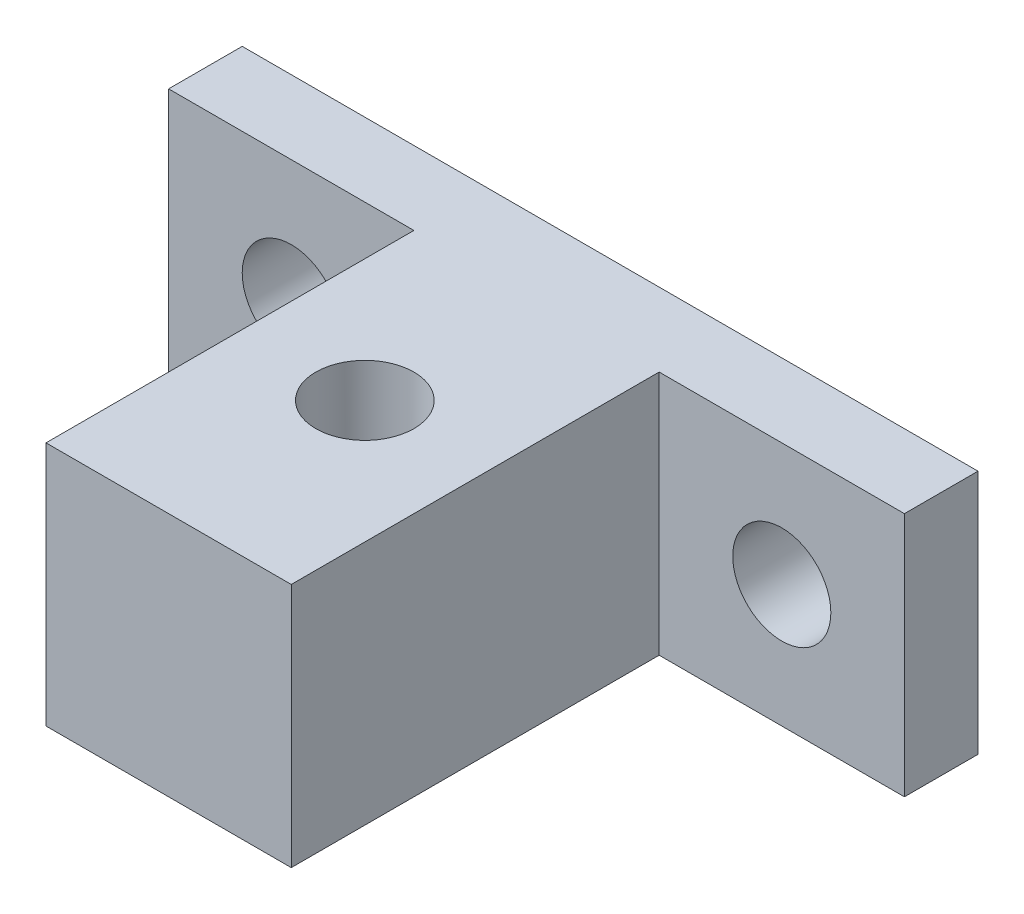
ISO-10303-21;
HEADER;
FILE_DESCRIPTION(('STEP AP214'),'2;1');
FILE_NAME('part.step','',(''),(''),'','','');
FILE_SCHEMA(('AUTOMOTIVE_DESIGN { 1 0 10303 214 1 1 1 1 }'));
ENDSEC;
DATA;
#1=APPLICATION_CONTEXT('core data for automotive mechanical design processes');
#2=APPLICATION_PROTOCOL_DEFINITION('international standard','automotive_design',2000,#1);
#3=PRODUCT_CONTEXT('',#1,'mechanical');
#4=PRODUCT('Part','Part','',(#3));
#5=PRODUCT_RELATED_PRODUCT_CATEGORY('part','',(#4));
#6=PRODUCT_DEFINITION_FORMATION('','',#4);
#7=PRODUCT_DEFINITION_CONTEXT('part definition',#1,'design');
#8=PRODUCT_DEFINITION('design','',#6,#7);
#9=PRODUCT_DEFINITION_SHAPE('','',#8);
#10=(LENGTH_UNIT() NAMED_UNIT(*) SI_UNIT(.MILLI.,.METRE.));
#11=(NAMED_UNIT(*) PLANE_ANGLE_UNIT() SI_UNIT($,.RADIAN.));
#12=(NAMED_UNIT(*) SI_UNIT($,.STERADIAN.) SOLID_ANGLE_UNIT());
#13=UNCERTAINTY_MEASURE_WITH_UNIT(LENGTH_MEASURE(1.E-05),#10,'distance_accuracy_value','');
#14=(GEOMETRIC_REPRESENTATION_CONTEXT(3) GLOBAL_UNCERTAINTY_ASSIGNED_CONTEXT((#13)) GLOBAL_UNIT_ASSIGNED_CONTEXT((#10,
#11,#12)) REPRESENTATION_CONTEXT('',''));
#15=CARTESIAN_POINT('',(0.,0.,0.));
#16=DIRECTION('',(0.,0.,1.));
#17=DIRECTION('',(1.,0.,0.));
#18=AXIS2_PLACEMENT_3D('',#15,#16,#17);
#19=CARTESIAN_POINT('',(0.,0.,3.));
#20=DIRECTION('',(0.,0.,-1.));
#21=DIRECTION('',(-1.,0.,0.));
#22=AXIS2_PLACEMENT_3D('',#19,#20,#21);
#23=PLANE('',#22);
#24=CARTESIAN_POINT('',(20.,-8.30000000000009,3.));
#25=DIRECTION('',(0.,0.,1.));
#26=DIRECTION('',(1.,0.,0.));
#27=AXIS2_PLACEMENT_3D('',#24,#25,#26);
#28=CIRCLE('',#27,2.);
#29=CARTESIAN_POINT('',(22.,-8.30000000000009,3.));
#30=VERTEX_POINT('',#29);
#31=EDGE_CURVE('E194',#30,#30,#28,.T.);
#32=ORIENTED_EDGE('',*,*,#31,.F.);
#33=EDGE_LOOP('',(#32));
#34=FACE_BOUND('',#33,.T.);
#35=DIRECTION('',(0.,1.,0.));
#36=VECTOR('',#35,1.);
#37=CARTESIAN_POINT('',(15.,-3.30000000000009,3.));
#38=LINE('',#37,#36);
#39=CARTESIAN_POINT('',(15.,-13.3000000000001,3.));
#40=VERTEX_POINT('',#39);
#41=CARTESIAN_POINT('',(15.,-3.30000000000009,3.));
#42=VERTEX_POINT('',#41);
#43=EDGE_CURVE('E56',#40,#42,#38,.T.);
#44=ORIENTED_EDGE('',*,*,#43,.F.);
#45=DIRECTION('',(1.,0.,0.));
#46=VECTOR('',#45,1.);
#47=CARTESIAN_POINT('',(25.,-13.3000000000001,3.));
#48=LINE('',#47,#46);
#49=CARTESIAN_POINT('',(25.,-13.3000000000001,3.));
#50=VERTEX_POINT('',#49);
#51=EDGE_CURVE('E209',#40,#50,#48,.T.);
#52=ORIENTED_EDGE('',*,*,#51,.T.);
#53=DIRECTION('',(0.,1.,0.));
#54=VECTOR('',#53,1.);
#55=CARTESIAN_POINT('',(25.,-3.30000000000009,3.));
#56=LINE('',#55,#54);
#57=CARTESIAN_POINT('',(25.,-3.30000000000009,3.));
#58=VERTEX_POINT('',#57);
#59=EDGE_CURVE('E200',#50,#58,#56,.T.);
#60=ORIENTED_EDGE('',*,*,#59,.T.);
#61=DIRECTION('',(-1.,0.,0.));
#62=VECTOR('',#61,1.);
#63=CARTESIAN_POINT('',(25.,-3.30000000000009,3.));
#64=LINE('',#63,#62);
#65=EDGE_CURVE('E205',#58,#42,#64,.T.);
#66=ORIENTED_EDGE('',*,*,#65,.T.);
#67=EDGE_LOOP('',(#44,#52,#60,#66));
#68=FACE_BOUND('',#67,.T.);
#69=ADVANCED_FACE('F33',(#34,#68),#23,.F.);
#70=CARTESIAN_POINT('',(0.,-8.30000000000009,3.));
#71=DIRECTION('',(0.,0.,1.));
#72=DIRECTION('',(-1.,0.,0.));
#73=AXIS2_PLACEMENT_3D('',#70,#71,#72);
#74=CIRCLE('',#73,2.);
#75=CARTESIAN_POINT('',(-2.,-8.30000000000009,3.));
#76=VERTEX_POINT('',#75);
#77=EDGE_CURVE('E188',#76,#76,#74,.T.);
#78=ORIENTED_EDGE('',*,*,#77,.F.);
#79=EDGE_LOOP('',(#78));
#80=FACE_BOUND('',#79,.T.);
#81=DIRECTION('',(0.,-1.,0.));
#82=VECTOR('',#81,1.);
#83=CARTESIAN_POINT('',(5.,-3.30000000000009,3.));
#84=LINE('',#83,#82);
#85=CARTESIAN_POINT('',(5.,-3.30000000000009,3.));
#86=VERTEX_POINT('',#85);
#87=CARTESIAN_POINT('',(5.00000000000001,-13.3000000000001,3.));
#88=VERTEX_POINT('',#87);
#89=EDGE_CURVE('E158',#86,#88,#84,.T.);
#90=ORIENTED_EDGE('',*,*,#89,.F.);
#91=CARTESIAN_POINT('',(-5.,-3.30000000000009,3.));
#92=VERTEX_POINT('',#91);
#93=EDGE_CURVE('E203',#86,#92,#64,.T.);
#94=ORIENTED_EDGE('',*,*,#93,.T.);
#95=DIRECTION('',(0.,-1.,0.));
#96=VECTOR('',#95,1.);
#97=CARTESIAN_POINT('',(-5.,-3.30000000000009,3.));
#98=LINE('',#97,#96);
#99=CARTESIAN_POINT('',(-5.,-13.3000000000001,3.));
#100=VERTEX_POINT('',#99);
#101=EDGE_CURVE('E207',#92,#100,#98,.T.);
#102=ORIENTED_EDGE('',*,*,#101,.T.);
#103=EDGE_CURVE('E210',#100,#88,#48,.T.);
#104=ORIENTED_EDGE('',*,*,#103,.T.);
#105=EDGE_LOOP('',(#90,#94,#102,#104));
#106=FACE_BOUND('',#105,.T.);
#107=ADVANCED_FACE('F259',(#80,#106),#23,.F.);
#108=CARTESIAN_POINT('',(0.,0.,0.));
#109=DIRECTION('',(0.,0.,-1.));
#110=DIRECTION('',(-1.,0.,0.));
#111=AXIS2_PLACEMENT_3D('',#108,#109,#110);
#112=PLANE('',#111);
#113=CARTESIAN_POINT('',(20.,-8.30000000000009,0.));
#114=DIRECTION('',(0.,0.,1.));
#115=DIRECTION('',(1.,0.,0.));
#116=AXIS2_PLACEMENT_3D('',#113,#114,#115);
#117=CIRCLE('',#116,2.);
#118=CARTESIAN_POINT('',(22.,-8.30000000000009,0.));
#119=VERTEX_POINT('',#118);
#120=EDGE_CURVE('E191',#119,#119,#117,.T.);
#121=ORIENTED_EDGE('',*,*,#120,.T.);
#122=EDGE_LOOP('',(#121));
#123=FACE_BOUND('',#122,.T.);
#124=DIRECTION('',(0.,1.,0.));
#125=VECTOR('',#124,1.);
#126=CARTESIAN_POINT('',(25.,-3.30000000000009,0.));
#127=LINE('',#126,#125);
#128=CARTESIAN_POINT('',(25.,-13.3000000000001,0.));
#129=VERTEX_POINT('',#128);
#130=CARTESIAN_POINT('',(25.,-3.30000000000009,0.));
#131=VERTEX_POINT('',#130);
#132=EDGE_CURVE('E197',#129,#131,#127,.T.);
#133=ORIENTED_EDGE('',*,*,#132,.F.);
#134=DIRECTION('',(1.,0.,0.));
#135=VECTOR('',#134,1.);
#136=CARTESIAN_POINT('',(25.,-13.3000000000001,0.));
#137=LINE('',#136,#135);
#138=CARTESIAN_POINT('',(-5.,-13.3000000000001,0.));
#139=VERTEX_POINT('',#138);
#140=EDGE_CURVE('E204',#139,#129,#137,.T.);
#141=ORIENTED_EDGE('',*,*,#140,.F.);
#142=DIRECTION('',(0.,-1.,0.));
#143=VECTOR('',#142,1.);
#144=CARTESIAN_POINT('',(-5.,-3.30000000000009,0.));
#145=LINE('',#144,#143);
#146=CARTESIAN_POINT('',(-5.,-3.30000000000009,0.));
#147=VERTEX_POINT('',#146);
#148=EDGE_CURVE('E217',#147,#139,#145,.T.);
#149=ORIENTED_EDGE('',*,*,#148,.F.);
#150=DIRECTION('',(-1.,0.,0.));
#151=VECTOR('',#150,1.);
#152=CARTESIAN_POINT('',(25.,-3.30000000000009,0.));
#153=LINE('',#152,#151);
#154=EDGE_CURVE('E215',#131,#147,#153,.T.);
#155=ORIENTED_EDGE('',*,*,#154,.F.);
#156=EDGE_LOOP('',(#133,#141,#149,#155));
#157=FACE_BOUND('',#156,.T.);
#158=CARTESIAN_POINT('',(0.,-8.30000000000009,0.));
#159=DIRECTION('',(0.,0.,1.));
#160=DIRECTION('',(-1.,0.,0.));
#161=AXIS2_PLACEMENT_3D('',#158,#159,#160);
#162=CIRCLE('',#161,2.);
#163=CARTESIAN_POINT('',(-2.,-8.30000000000009,0.));
#164=VERTEX_POINT('',#163);
#165=EDGE_CURVE('E187',#164,#164,#162,.T.);
#166=ORIENTED_EDGE('',*,*,#165,.T.);
#167=EDGE_LOOP('',(#166));
#168=FACE_BOUND('',#167,.T.);
#169=ADVANCED_FACE('F236',(#123,#157,#168),#112,.T.);
#170=CARTESIAN_POINT('',(25.,-3.30000000000009,3.));
#171=DIRECTION('',(-1.,0.,0.));
#172=DIRECTION('',(0.,0.,1.));
#173=AXIS2_PLACEMENT_3D('',#170,#171,#172);
#174=PLANE('',#173);
#175=ORIENTED_EDGE('',*,*,#132,.T.);
#176=DIRECTION('',(0.,0.,-1.));
#177=VECTOR('',#176,1.);
#178=CARTESIAN_POINT('',(25.,-3.30000000000009,3.));
#179=LINE('',#178,#177);
#180=EDGE_CURVE('E11',#58,#131,#179,.T.);
#181=ORIENTED_EDGE('',*,*,#180,.F.);
#182=ORIENTED_EDGE('',*,*,#59,.F.);
#183=DIRECTION('',(0.,0.,-1.));
#184=VECTOR('',#183,1.);
#185=CARTESIAN_POINT('',(25.,-13.3000000000001,3.));
#186=LINE('',#185,#184);
#187=EDGE_CURVE('E212',#50,#129,#186,.T.);
#188=ORIENTED_EDGE('',*,*,#187,.T.);
#189=EDGE_LOOP('',(#175,#181,#182,#188));
#190=FACE_BOUND('',#189,.T.);
#191=ADVANCED_FACE('F35',(#190),#174,.F.);
#192=CARTESIAN_POINT('',(25.,-3.30000000000009,3.));
#193=DIRECTION('',(0.,-1.,0.));
#194=DIRECTION('',(0.,0.,-1.));
#195=AXIS2_PLACEMENT_3D('',#192,#193,#194);
#196=PLANE('',#195);
#197=CARTESIAN_POINT('',(10.,-3.30000000000009,10.));
#198=DIRECTION('',(0.,-1.,0.));
#199=DIRECTION('',(0.,0.,-1.));
#200=AXIS2_PLACEMENT_3D('',#197,#198,#199);
#201=CIRCLE('',#200,2.);
#202=CARTESIAN_POINT('',(10.,-3.30000000000009,8.));
#203=VERTEX_POINT('',#202);
#204=EDGE_CURVE('E295',#203,#203,#201,.T.);
#205=ORIENTED_EDGE('',*,*,#204,.T.);
#206=EDGE_LOOP('',(#205));
#207=FACE_BOUND('',#206,.T.);
#208=ORIENTED_EDGE('',*,*,#154,.T.);
#209=DIRECTION('',(0.,0.,-1.));
#210=VECTOR('',#209,1.);
#211=CARTESIAN_POINT('',(-5.,-3.30000000000009,3.));
#212=LINE('',#211,#210);
#213=EDGE_CURVE('E41',#92,#147,#212,.T.);
#214=ORIENTED_EDGE('',*,*,#213,.F.);
#215=ORIENTED_EDGE('',*,*,#93,.F.);
#216=DIRECTION('',(0.,0.,-1.));
#217=VECTOR('',#216,1.);
#218=CARTESIAN_POINT('',(5.,-3.30000000000009,18.));
#219=LINE('',#218,#217);
#220=CARTESIAN_POINT('',(5.,-3.30000000000009,18.));
#221=VERTEX_POINT('',#220);
#222=EDGE_CURVE('E181',#221,#86,#219,.T.);
#223=ORIENTED_EDGE('',*,*,#222,.F.);
#224=DIRECTION('',(-1.,0.,0.));
#225=VECTOR('',#224,1.);
#226=CARTESIAN_POINT('',(15.,-3.30000000000009,18.));
#227=LINE('',#226,#225);
#228=CARTESIAN_POINT('',(15.,-3.30000000000009,18.));
#229=VERTEX_POINT('',#228);
#230=EDGE_CURVE('E167',#229,#221,#227,.T.);
#231=ORIENTED_EDGE('',*,*,#230,.F.);
#232=DIRECTION('',(0.,0.,-1.));
#233=VECTOR('',#232,1.);
#234=CARTESIAN_POINT('',(15.,-3.30000000000009,18.));
#235=LINE('',#234,#233);
#236=EDGE_CURVE('E184',#229,#42,#235,.T.);
#237=ORIENTED_EDGE('',*,*,#236,.T.);
#238=ORIENTED_EDGE('',*,*,#65,.F.);
#239=ORIENTED_EDGE('',*,*,#180,.T.);
#240=EDGE_LOOP('',(#208,#214,#215,#223,#231,#237,#238,#239));
#241=FACE_BOUND('',#240,.T.);
#242=ADVANCED_FACE('F260',(#207,#241),#196,.F.);
#243=CARTESIAN_POINT('',(-5.,-3.30000000000009,3.));
#244=DIRECTION('',(1.,0.,0.));
#245=DIRECTION('',(0.,0.,-1.));
#246=AXIS2_PLACEMENT_3D('',#243,#244,#245);
#247=PLANE('',#246);
#248=ORIENTED_EDGE('',*,*,#148,.T.);
#249=DIRECTION('',(0.,0.,-1.));
#250=VECTOR('',#249,1.);
#251=CARTESIAN_POINT('',(-5.,-13.3000000000001,3.));
#252=LINE('',#251,#250);
#253=EDGE_CURVE('E222',#100,#139,#252,.T.);
#254=ORIENTED_EDGE('',*,*,#253,.F.);
#255=ORIENTED_EDGE('',*,*,#101,.F.);
#256=ORIENTED_EDGE('',*,*,#213,.T.);
#257=EDGE_LOOP('',(#248,#254,#255,#256));
#258=FACE_BOUND('',#257,.T.);
#259=ADVANCED_FACE('F229',(#258),#247,.F.);
#260=CARTESIAN_POINT('',(25.,-13.3000000000001,3.));
#261=DIRECTION('',(0.,1.,0.));
#262=DIRECTION('',(0.,0.,1.));
#263=AXIS2_PLACEMENT_3D('',#260,#261,#262);
#264=PLANE('',#263);
#265=DIRECTION('',(-0.866025403784439,0.,-0.5));
#266=VECTOR('',#265,1.);
#267=CARTESIAN_POINT('',(19.9189110867545,-13.3000000000001,11.8007041555162));
#268=LINE('',#267,#266);
#269=CARTESIAN_POINT('',(13.4,-13.3000000000001,8.03700908475527));
#270=VERTEX_POINT('',#269);
#271=CARTESIAN_POINT('',(10.,-13.3000000000001,6.07401816951054));
#272=VERTEX_POINT('',#271);
#273=EDGE_CURVE('E48',#270,#272,#268,.T.);
#274=ORIENTED_EDGE('',*,*,#273,.T.);
#275=DIRECTION('',(-0.866025403784439,0.,0.5));
#276=VECTOR('',#275,1.);
#277=CARTESIAN_POINT('',(22.5810889132455,-13.3000000000001,-1.18967690125038));
#278=LINE('',#277,#276);
#279=CARTESIAN_POINT('',(6.60000000000001,-13.3000000000001,8.03700908475527));
#280=VERTEX_POINT('',#279);
#281=EDGE_CURVE('E155',#272,#280,#278,.T.);
#282=ORIENTED_EDGE('',*,*,#281,.T.);
#283=DIRECTION('',(0.,0.,1.));
#284=VECTOR('',#283,1.);
#285=CARTESIAN_POINT('',(6.60000000000001,-13.3000000000001,3.));
#286=LINE('',#285,#284);
#287=CARTESIAN_POINT('',(6.60000000000001,-13.3000000000001,11.9629909152447));
#288=VERTEX_POINT('',#287);
#289=EDGE_CURVE('E297',#280,#288,#286,.T.);
#290=ORIENTED_EDGE('',*,*,#289,.T.);
#291=DIRECTION('',(0.866025403784439,0.,0.5));
#292=VECTOR('',#291,1.);
#293=CARTESIAN_POINT('',(16.5189110867545,-13.3000000000001,17.6896769012504));
#294=LINE('',#293,#292);
#295=CARTESIAN_POINT('',(10.,-13.3000000000001,13.9259818304895));
#296=VERTEX_POINT('',#295);
#297=EDGE_CURVE('E306',#288,#296,#294,.T.);
#298=ORIENTED_EDGE('',*,*,#297,.T.);
#299=DIRECTION('',(0.866025403784439,0.,-0.5));
#300=VECTOR('',#299,1.);
#301=CARTESIAN_POINT('',(25.9810889132455,-13.3000000000001,4.69929584448381));
#302=LINE('',#301,#300);
#303=CARTESIAN_POINT('',(13.4,-13.3000000000001,11.9629909152447));
#304=VERTEX_POINT('',#303);
#305=EDGE_CURVE('E309',#296,#304,#302,.T.);
#306=ORIENTED_EDGE('',*,*,#305,.T.);
#307=DIRECTION('',(0.,0.,-1.));
#308=VECTOR('',#307,1.);
#309=CARTESIAN_POINT('',(13.4,-13.3000000000001,3.));
#310=LINE('',#309,#308);
#311=EDGE_CURVE('E151',#304,#270,#310,.T.);
#312=ORIENTED_EDGE('',*,*,#311,.T.);
#313=EDGE_LOOP('',(#274,#282,#290,#298,#306,#312));
#314=FACE_BOUND('',#313,.T.);
#315=ORIENTED_EDGE('',*,*,#140,.T.);
#316=ORIENTED_EDGE('',*,*,#187,.F.);
#317=ORIENTED_EDGE('',*,*,#51,.F.);
#318=DIRECTION('',(0.,0.,-1.));
#319=VECTOR('',#318,1.);
#320=CARTESIAN_POINT('',(15.,-13.3000000000001,18.));
#321=LINE('',#320,#319);
#322=CARTESIAN_POINT('',(15.,-13.3000000000001,18.));
#323=VERTEX_POINT('',#322);
#324=EDGE_CURVE('E172',#323,#40,#321,.T.);
#325=ORIENTED_EDGE('',*,*,#324,.F.);
#326=DIRECTION('',(1.,0.,0.));
#327=VECTOR('',#326,1.);
#328=CARTESIAN_POINT('',(15.,-13.3000000000001,18.));
#329=LINE('',#328,#327);
#330=CARTESIAN_POINT('',(5.00000000000001,-13.3000000000001,18.));
#331=VERTEX_POINT('',#330);
#332=EDGE_CURVE('E171',#331,#323,#329,.T.);
#333=ORIENTED_EDGE('',*,*,#332,.F.);
#334=DIRECTION('',(0.,0.,-1.));
#335=VECTOR('',#334,1.);
#336=CARTESIAN_POINT('',(5.00000000000001,-13.3000000000001,18.));
#337=LINE('',#336,#335);
#338=EDGE_CURVE('E178',#331,#88,#337,.T.);
#339=ORIENTED_EDGE('',*,*,#338,.T.);
#340=ORIENTED_EDGE('',*,*,#103,.F.);
#341=ORIENTED_EDGE('',*,*,#253,.T.);
#342=EDGE_LOOP('',(#315,#316,#317,#325,#333,#339,#340,#341));
#343=FACE_BOUND('',#342,.T.);
#344=ADVANCED_FACE('F240',(#314,#343),#264,.F.);
#345=CARTESIAN_POINT('',(20.,-8.30000000000009,3.));
#346=DIRECTION('',(0.,0.,-1.));
#347=DIRECTION('',(-1.,0.,0.));
#348=AXIS2_PLACEMENT_3D('',#345,#346,#347);
#349=CYLINDRICAL_SURFACE('',#348,2.);
#350=ORIENTED_EDGE('',*,*,#31,.T.);
#351=EDGE_LOOP('',(#350));
#352=FACE_BOUND('',#351,.T.);
#353=ORIENTED_EDGE('',*,*,#120,.F.);
#354=EDGE_LOOP('',(#353));
#355=FACE_BOUND('',#354,.T.);
#356=ADVANCED_FACE('F279',(#352,#355),#349,.F.);
#357=CARTESIAN_POINT('',(0.,-8.30000000000009,3.));
#358=DIRECTION('',(0.,0.,-1.));
#359=DIRECTION('',(-1.,0.,0.));
#360=AXIS2_PLACEMENT_3D('',#357,#358,#359);
#361=CYLINDRICAL_SURFACE('',#360,2.);
#362=ORIENTED_EDGE('',*,*,#77,.T.);
#363=EDGE_LOOP('',(#362));
#364=FACE_BOUND('',#363,.T.);
#365=ORIENTED_EDGE('',*,*,#165,.F.);
#366=EDGE_LOOP('',(#365));
#367=FACE_BOUND('',#366,.T.);
#368=ADVANCED_FACE('F289',(#364,#367),#361,.F.);
#369=CARTESIAN_POINT('',(15.,-3.30000000000009,18.));
#370=DIRECTION('',(-1.,0.,0.));
#371=DIRECTION('',(0.,-1.,0.));
#372=AXIS2_PLACEMENT_3D('',#369,#370,#371);
#373=PLANE('',#372);
#374=ORIENTED_EDGE('',*,*,#43,.T.);
#375=ORIENTED_EDGE('',*,*,#236,.F.);
#376=DIRECTION('',(0.,1.,0.));
#377=VECTOR('',#376,1.);
#378=CARTESIAN_POINT('',(15.,-3.30000000000009,18.));
#379=LINE('',#378,#377);
#380=EDGE_CURVE('E164',#323,#229,#379,.T.);
#381=ORIENTED_EDGE('',*,*,#380,.F.);
#382=ORIENTED_EDGE('',*,*,#324,.T.);
#383=EDGE_LOOP('',(#374,#375,#381,#382));
#384=FACE_BOUND('',#383,.T.);
#385=ADVANCED_FACE('F249',(#384),#373,.F.);
#386=CARTESIAN_POINT('',(5.,-3.30000000000009,18.));
#387=DIRECTION('',(1.,0.,0.));
#388=DIRECTION('',(0.,1.,0.));
#389=AXIS2_PLACEMENT_3D('',#386,#387,#388);
#390=PLANE('',#389);
#391=ORIENTED_EDGE('',*,*,#89,.T.);
#392=ORIENTED_EDGE('',*,*,#338,.F.);
#393=DIRECTION('',(0.,-1.,0.));
#394=VECTOR('',#393,1.);
#395=CARTESIAN_POINT('',(5.,-3.30000000000009,18.));
#396=LINE('',#395,#394);
#397=EDGE_CURVE('E169',#221,#331,#396,.T.);
#398=ORIENTED_EDGE('',*,*,#397,.F.);
#399=ORIENTED_EDGE('',*,*,#222,.T.);
#400=EDGE_LOOP('',(#391,#392,#398,#399));
#401=FACE_BOUND('',#400,.T.);
#402=ADVANCED_FACE('F257',(#401),#390,.F.);
#403=CARTESIAN_POINT('',(0.,0.,18.));
#404=DIRECTION('',(0.,0.,-1.));
#405=DIRECTION('',(-1.,0.,0.));
#406=AXIS2_PLACEMENT_3D('',#403,#404,#405);
#407=PLANE('',#406);
#408=ORIENTED_EDGE('',*,*,#380,.T.);
#409=ORIENTED_EDGE('',*,*,#230,.T.);
#410=ORIENTED_EDGE('',*,*,#397,.T.);
#411=ORIENTED_EDGE('',*,*,#332,.T.);
#412=EDGE_LOOP('',(#408,#409,#410,#411));
#413=FACE_BOUND('',#412,.T.);
#414=ADVANCED_FACE('F252',(#413),#407,.F.);
#415=CARTESIAN_POINT('',(0.,-8.30000000000009,0.));
#416=DIRECTION('',(0.,1.,0.));
#417=DIRECTION('',(0.,0.,1.));
#418=AXIS2_PLACEMENT_3D('',#415,#416,#417);
#419=PLANE('',#418);
#420=DIRECTION('',(-0.866025403784439,0.,-0.5));
#421=VECTOR('',#420,1.);
#422=CARTESIAN_POINT('',(19.9189110867545,-8.30000000000009,11.8007041555162));
#423=LINE('',#422,#421);
#424=CARTESIAN_POINT('',(13.4,-8.30000000000009,8.03700908475527));
#425=VERTEX_POINT('',#424);
#426=CARTESIAN_POINT('',(10.,-8.30000000000009,6.07401816951054));
#427=VERTEX_POINT('',#426);
#428=EDGE_CURVE('E141',#425,#427,#423,.T.);
#429=ORIENTED_EDGE('',*,*,#428,.F.);
#430=DIRECTION('',(0.,0.,-1.));
#431=VECTOR('',#430,1.);
#432=CARTESIAN_POINT('',(13.4,-8.30000000000009,3.));
#433=LINE('',#432,#431);
#434=CARTESIAN_POINT('',(13.4,-8.30000000000009,11.9629909152447));
#435=VERTEX_POINT('',#434);
#436=EDGE_CURVE('E302',#435,#425,#433,.T.);
#437=ORIENTED_EDGE('',*,*,#436,.F.);
#438=DIRECTION('',(0.866025403784439,0.,-0.5));
#439=VECTOR('',#438,1.);
#440=CARTESIAN_POINT('',(25.9810889132455,-8.30000000000009,4.69929584448381));
#441=LINE('',#440,#439);
#442=CARTESIAN_POINT('',(10.,-8.30000000000009,13.9259818304895));
#443=VERTEX_POINT('',#442);
#444=EDGE_CURVE('E329',#443,#435,#441,.T.);
#445=ORIENTED_EDGE('',*,*,#444,.F.);
#446=DIRECTION('',(0.866025403784439,0.,0.5));
#447=VECTOR('',#446,1.);
#448=CARTESIAN_POINT('',(16.5189110867545,-8.30000000000009,17.6896769012504));
#449=LINE('',#448,#447);
#450=CARTESIAN_POINT('',(6.60000000000001,-8.30000000000009,11.9629909152447));
#451=VERTEX_POINT('',#450);
#452=EDGE_CURVE('E332',#451,#443,#449,.T.);
#453=ORIENTED_EDGE('',*,*,#452,.F.);
#454=DIRECTION('',(0.,0.,1.));
#455=VECTOR('',#454,1.);
#456=CARTESIAN_POINT('',(6.60000000000001,-8.30000000000009,3.));
#457=LINE('',#456,#455);
#458=CARTESIAN_POINT('',(6.60000000000001,-8.30000000000009,8.03700908475527));
#459=VERTEX_POINT('',#458);
#460=EDGE_CURVE('E143',#459,#451,#457,.T.);
#461=ORIENTED_EDGE('',*,*,#460,.F.);
#462=DIRECTION('',(-0.866025403784439,0.,0.5));
#463=VECTOR('',#462,1.);
#464=CARTESIAN_POINT('',(22.5810889132455,-8.30000000000009,-1.18967690125038));
#465=LINE('',#464,#463);
#466=EDGE_CURVE('E136',#427,#459,#465,.T.);
#467=ORIENTED_EDGE('',*,*,#466,.F.);
#468=EDGE_LOOP('',(#429,#437,#445,#453,#461,#467));
#469=FACE_BOUND('',#468,.T.);
#470=CARTESIAN_POINT('',(10.,-8.30000000000009,10.));
#471=DIRECTION('',(0.,1.,0.));
#472=DIRECTION('',(0.,0.,1.));
#473=AXIS2_PLACEMENT_3D('',#470,#471,#472);
#474=CIRCLE('',#473,2.);
#475=CARTESIAN_POINT('',(10.,-8.30000000000009,12.));
#476=VERTEX_POINT('',#475);
#477=EDGE_CURVE('E299',#476,#476,#474,.T.);
#478=ORIENTED_EDGE('',*,*,#477,.T.);
#479=EDGE_LOOP('',(#478));
#480=FACE_BOUND('',#479,.T.);
#481=ADVANCED_FACE('F138',(#469,#480),#419,.F.);
#482=CARTESIAN_POINT('',(19.9189110867545,-8.30000000000009,11.8007041555162));
#483=DIRECTION('',(-0.5,0.,0.866025403784439));
#484=DIRECTION('',(0.866025403784439,0.,0.5));
#485=AXIS2_PLACEMENT_3D('',#482,#483,#484);
#486=PLANE('',#485);
#487=ORIENTED_EDGE('',*,*,#273,.F.);
#488=DIRECTION('',(0.,-1.,0.));
#489=VECTOR('',#488,1.);
#490=CARTESIAN_POINT('',(13.4,-8.30000000000009,8.03700908475527));
#491=LINE('',#490,#489);
#492=EDGE_CURVE('E150',#425,#270,#491,.T.);
#493=ORIENTED_EDGE('',*,*,#492,.F.);
#494=ORIENTED_EDGE('',*,*,#428,.T.);
#495=DIRECTION('',(0.,-1.,0.));
#496=VECTOR('',#495,1.);
#497=CARTESIAN_POINT('',(10.,-8.30000000000009,6.07401816951054));
#498=LINE('',#497,#496);
#499=EDGE_CURVE('E149',#427,#272,#498,.T.);
#500=ORIENTED_EDGE('',*,*,#499,.T.);
#501=EDGE_LOOP('',(#487,#493,#494,#500));
#502=FACE_BOUND('',#501,.T.);
#503=ADVANCED_FACE('F148',(#502),#486,.T.);
#504=CARTESIAN_POINT('',(22.5810889132455,-8.30000000000009,-1.18967690125038));
#505=DIRECTION('',(0.5,0.,0.866025403784439));
#506=DIRECTION('',(0.866025403784439,0.,-0.5));
#507=AXIS2_PLACEMENT_3D('',#504,#505,#506);
#508=PLANE('',#507);
#509=ORIENTED_EDGE('',*,*,#281,.F.);
#510=ORIENTED_EDGE('',*,*,#499,.F.);
#511=ORIENTED_EDGE('',*,*,#466,.T.);
#512=DIRECTION('',(0.,-1.,0.));
#513=VECTOR('',#512,1.);
#514=CARTESIAN_POINT('',(6.60000000000001,-8.30000000000009,8.03700908475527));
#515=LINE('',#514,#513);
#516=EDGE_CURVE('E156',#459,#280,#515,.T.);
#517=ORIENTED_EDGE('',*,*,#516,.T.);
#518=EDGE_LOOP('',(#509,#510,#511,#517));
#519=FACE_BOUND('',#518,.T.);
#520=ADVANCED_FACE('F153',(#519),#508,.T.);
#521=CARTESIAN_POINT('',(6.60000000000001,-8.30000000000009,3.));
#522=DIRECTION('',(1.,0.,0.));
#523=DIRECTION('',(0.,0.,-1.));
#524=AXIS2_PLACEMENT_3D('',#521,#522,#523);
#525=PLANE('',#524);
#526=ORIENTED_EDGE('',*,*,#289,.F.);
#527=ORIENTED_EDGE('',*,*,#516,.F.);
#528=ORIENTED_EDGE('',*,*,#460,.T.);
#529=DIRECTION('',(0.,-1.,0.));
#530=VECTOR('',#529,1.);
#531=CARTESIAN_POINT('',(6.60000000000001,-8.30000000000009,11.9629909152447));
#532=LINE('',#531,#530);
#533=EDGE_CURVE('E160',#451,#288,#532,.T.);
#534=ORIENTED_EDGE('',*,*,#533,.T.);
#535=EDGE_LOOP('',(#526,#527,#528,#534));
#536=FACE_BOUND('',#535,.T.);
#537=ADVANCED_FACE('F320',(#536),#525,.T.);
#538=CARTESIAN_POINT('',(16.5189110867545,-8.30000000000009,17.6896769012504));
#539=DIRECTION('',(0.5,0.,-0.866025403784439));
#540=DIRECTION('',(-0.866025403784439,0.,-0.5));
#541=AXIS2_PLACEMENT_3D('',#538,#539,#540);
#542=PLANE('',#541);
#543=ORIENTED_EDGE('',*,*,#297,.F.);
#544=ORIENTED_EDGE('',*,*,#533,.F.);
#545=ORIENTED_EDGE('',*,*,#452,.T.);
#546=DIRECTION('',(0.,-1.,0.));
#547=VECTOR('',#546,1.);
#548=CARTESIAN_POINT('',(10.,-8.30000000000009,13.9259818304895));
#549=LINE('',#548,#547);
#550=EDGE_CURVE('E315',#443,#296,#549,.T.);
#551=ORIENTED_EDGE('',*,*,#550,.T.);
#552=EDGE_LOOP('',(#543,#544,#545,#551));
#553=FACE_BOUND('',#552,.T.);
#554=ADVANCED_FACE('F322',(#553),#542,.T.);
#555=CARTESIAN_POINT('',(25.9810889132455,-8.30000000000009,4.69929584448381));
#556=DIRECTION('',(-0.5,0.,-0.866025403784439));
#557=DIRECTION('',(-0.866025403784439,0.,0.5));
#558=AXIS2_PLACEMENT_3D('',#555,#556,#557);
#559=PLANE('',#558);
#560=ORIENTED_EDGE('',*,*,#305,.F.);
#561=ORIENTED_EDGE('',*,*,#550,.F.);
#562=ORIENTED_EDGE('',*,*,#444,.T.);
#563=DIRECTION('',(0.,-1.,0.));
#564=VECTOR('',#563,1.);
#565=CARTESIAN_POINT('',(13.4,-8.30000000000009,11.9629909152447));
#566=LINE('',#565,#564);
#567=EDGE_CURVE('E313',#435,#304,#566,.T.);
#568=ORIENTED_EDGE('',*,*,#567,.T.);
#569=EDGE_LOOP('',(#560,#561,#562,#568));
#570=FACE_BOUND('',#569,.T.);
#571=ADVANCED_FACE('F326',(#570),#559,.T.);
#572=CARTESIAN_POINT('',(13.4,-8.30000000000009,3.));
#573=DIRECTION('',(-1.,0.,0.));
#574=DIRECTION('',(0.,0.,1.));
#575=AXIS2_PLACEMENT_3D('',#572,#573,#574);
#576=PLANE('',#575);
#577=ORIENTED_EDGE('',*,*,#311,.F.);
#578=ORIENTED_EDGE('',*,*,#567,.F.);
#579=ORIENTED_EDGE('',*,*,#436,.T.);
#580=ORIENTED_EDGE('',*,*,#492,.T.);
#581=EDGE_LOOP('',(#577,#578,#579,#580));
#582=FACE_BOUND('',#581,.T.);
#583=ADVANCED_FACE('F331',(#582),#576,.T.);
#584=CARTESIAN_POINT('',(10.,-13.3000000000001,10.));
#585=DIRECTION('',(0.,1.,0.));
#586=DIRECTION('',(0.,0.,1.));
#587=AXIS2_PLACEMENT_3D('',#584,#585,#586);
#588=CYLINDRICAL_SURFACE('',#587,2.);
#589=ORIENTED_EDGE('',*,*,#477,.F.);
#590=EDGE_LOOP('',(#589));
#591=FACE_BOUND('',#590,.T.);
#592=ORIENTED_EDGE('',*,*,#204,.F.);
#593=EDGE_LOOP('',(#592));
#594=FACE_BOUND('',#593,.T.);
#595=ADVANCED_FACE('F339',(#591,#594),#588,.F.);
#596=CLOSED_SHELL('',(#69,#107,#169,#191,#242,#259,#344,#356,#368,#385,#402,#414,#481,#503,#520,
#537,#554,#571,#583,#595));
#597=MANIFOLD_SOLID_BREP('B2',#596);
#598=ADVANCED_BREP_SHAPE_REPRESENTATION('',(#18,#597),#14);
#599=SHAPE_DEFINITION_REPRESENTATION(#9,#598);
ENDSEC;
END-ISO-10303-21;
